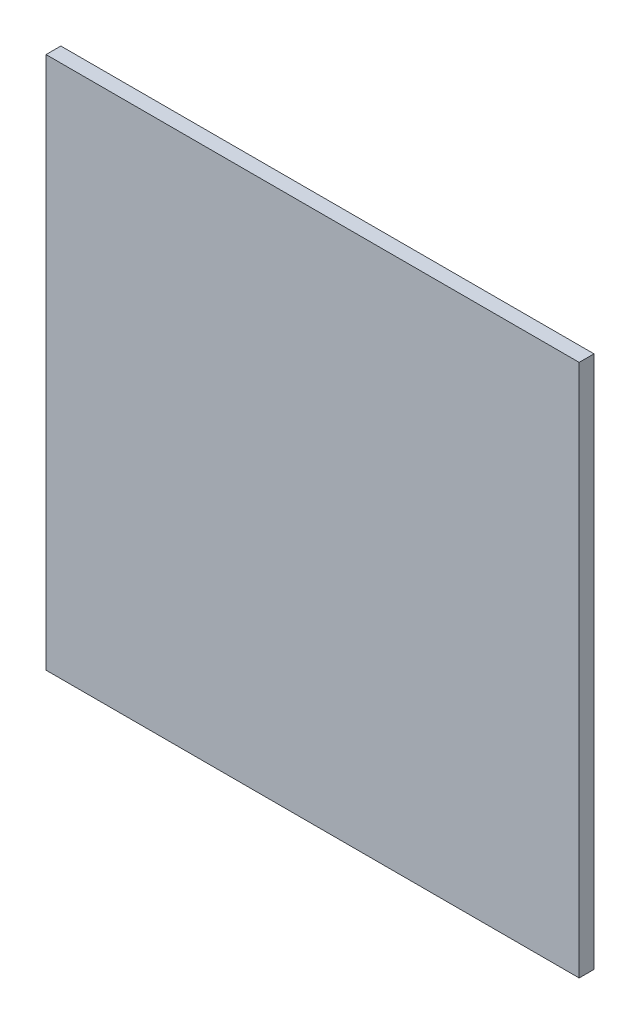
ISO-10303-21;
HEADER;
FILE_DESCRIPTION(('STEP AP214'),'2;1');
FILE_NAME('part.step','',(''),(''),'','','');
FILE_SCHEMA(('AUTOMOTIVE_DESIGN { 1 0 10303 214 1 1 1 1 }'));
ENDSEC;
DATA;
#1=APPLICATION_CONTEXT('core data for automotive mechanical design processes');
#2=APPLICATION_PROTOCOL_DEFINITION('international standard','automotive_design',2000,#1);
#3=PRODUCT_CONTEXT('',#1,'mechanical');
#4=PRODUCT('Part','Part','',(#3));
#5=PRODUCT_RELATED_PRODUCT_CATEGORY('part','',(#4));
#6=PRODUCT_DEFINITION_FORMATION('','',#4);
#7=PRODUCT_DEFINITION_CONTEXT('part definition',#1,'design');
#8=PRODUCT_DEFINITION('design','',#6,#7);
#9=PRODUCT_DEFINITION_SHAPE('','',#8);
#10=(LENGTH_UNIT() NAMED_UNIT(*) SI_UNIT(.MILLI.,.METRE.));
#11=(NAMED_UNIT(*) PLANE_ANGLE_UNIT() SI_UNIT($,.RADIAN.));
#12=(NAMED_UNIT(*) SI_UNIT($,.STERADIAN.) SOLID_ANGLE_UNIT());
#13=UNCERTAINTY_MEASURE_WITH_UNIT(LENGTH_MEASURE(1.E-05),#10,'distance_accuracy_value','');
#14=(GEOMETRIC_REPRESENTATION_CONTEXT(3) GLOBAL_UNCERTAINTY_ASSIGNED_CONTEXT((#13)) GLOBAL_UNIT_ASSIGNED_CONTEXT((#10,
#11,#12)) REPRESENTATION_CONTEXT('',''));
#15=CARTESIAN_POINT('',(0.,0.,0.));
#16=DIRECTION('',(0.,0.,1.));
#17=DIRECTION('',(1.,0.,0.));
#18=AXIS2_PLACEMENT_3D('',#15,#16,#17);
#19=CARTESIAN_POINT('',(90.,-90.,5.));
#20=DIRECTION('',(-1.,0.,0.));
#21=DIRECTION('',(0.,0.,1.));
#22=AXIS2_PLACEMENT_3D('',#19,#20,#21);
#23=PLANE('',#22);
#24=DIRECTION('',(0.,1.,0.));
#25=VECTOR('',#24,1.);
#26=CARTESIAN_POINT('',(90.,-90.,0.));
#27=LINE('',#26,#25);
#28=CARTESIAN_POINT('',(90.,-90.,0.));
#29=VERTEX_POINT('',#28);
#30=CARTESIAN_POINT('',(90.,90.,0.));
#31=VERTEX_POINT('',#30);
#32=EDGE_CURVE('E97',#29,#31,#27,.T.);
#33=ORIENTED_EDGE('',*,*,#32,.T.);
#34=DIRECTION('',(0.,0.,-1.));
#35=VECTOR('',#34,1.);
#36=CARTESIAN_POINT('',(90.,90.,5.));
#37=LINE('',#36,#35);
#38=CARTESIAN_POINT('',(90.,90.,5.));
#39=VERTEX_POINT('',#38);
#40=EDGE_CURVE('E11',#39,#31,#37,.T.);
#41=ORIENTED_EDGE('',*,*,#40,.F.);
#42=DIRECTION('',(0.,1.,0.));
#43=VECTOR('',#42,1.);
#44=CARTESIAN_POINT('',(90.,-90.,5.));
#45=LINE('',#44,#43);
#46=CARTESIAN_POINT('',(90.,-90.,5.));
#47=VERTEX_POINT('',#46);
#48=EDGE_CURVE('E85',#47,#39,#45,.T.);
#49=ORIENTED_EDGE('',*,*,#48,.F.);
#50=DIRECTION('',(0.,0.,-1.));
#51=VECTOR('',#50,1.);
#52=CARTESIAN_POINT('',(90.,-90.,5.));
#53=LINE('',#52,#51);
#54=EDGE_CURVE('E93',#47,#29,#53,.T.);
#55=ORIENTED_EDGE('',*,*,#54,.T.);
#56=EDGE_LOOP('',(#33,#41,#49,#55));
#57=FACE_BOUND('',#56,.T.);
#58=ADVANCED_FACE('F34',(#57),#23,.F.);
#59=CARTESIAN_POINT('',(-90.,90.,5.));
#60=DIRECTION('',(0.,-1.,0.));
#61=DIRECTION('',(0.,0.,-1.));
#62=AXIS2_PLACEMENT_3D('',#59,#60,#61);
#63=PLANE('',#62);
#64=DIRECTION('',(-1.,0.,0.));
#65=VECTOR('',#64,1.);
#66=CARTESIAN_POINT('',(-90.,90.,0.));
#67=LINE('',#66,#65);
#68=CARTESIAN_POINT('',(-90.,90.,0.));
#69=VERTEX_POINT('',#68);
#70=EDGE_CURVE('E89',#31,#69,#67,.T.);
#71=ORIENTED_EDGE('',*,*,#70,.T.);
#72=DIRECTION('',(0.,0.,-1.));
#73=VECTOR('',#72,1.);
#74=CARTESIAN_POINT('',(-90.,90.,5.));
#75=LINE('',#74,#73);
#76=CARTESIAN_POINT('',(-90.,90.,5.));
#77=VERTEX_POINT('',#76);
#78=EDGE_CURVE('E42',#77,#69,#75,.T.);
#79=ORIENTED_EDGE('',*,*,#78,.F.);
#80=DIRECTION('',(-1.,0.,0.));
#81=VECTOR('',#80,1.);
#82=CARTESIAN_POINT('',(-90.,90.,5.));
#83=LINE('',#82,#81);
#84=EDGE_CURVE('E80',#39,#77,#83,.T.);
#85=ORIENTED_EDGE('',*,*,#84,.F.);
#86=ORIENTED_EDGE('',*,*,#40,.T.);
#87=EDGE_LOOP('',(#71,#79,#85,#86));
#88=FACE_BOUND('',#87,.T.);
#89=ADVANCED_FACE('F88',(#88),#63,.F.);
#90=CARTESIAN_POINT('',(-90.,-90.,5.));
#91=DIRECTION('',(1.,0.,0.));
#92=DIRECTION('',(0.,0.,-1.));
#93=AXIS2_PLACEMENT_3D('',#90,#91,#92);
#94=PLANE('',#93);
#95=DIRECTION('',(0.,-1.,0.));
#96=VECTOR('',#95,1.);
#97=CARTESIAN_POINT('',(-90.,-90.,0.));
#98=LINE('',#97,#96);
#99=CARTESIAN_POINT('',(-90.,-90.,0.));
#100=VERTEX_POINT('',#99);
#101=EDGE_CURVE('E67',#69,#100,#98,.T.);
#102=ORIENTED_EDGE('',*,*,#101,.T.);
#103=DIRECTION('',(0.,0.,-1.));
#104=VECTOR('',#103,1.);
#105=CARTESIAN_POINT('',(-90.,-90.,5.));
#106=LINE('',#105,#104);
#107=CARTESIAN_POINT('',(-90.,-90.,5.));
#108=VERTEX_POINT('',#107);
#109=EDGE_CURVE('E90',#108,#100,#106,.T.);
#110=ORIENTED_EDGE('',*,*,#109,.F.);
#111=DIRECTION('',(0.,-1.,0.));
#112=VECTOR('',#111,1.);
#113=CARTESIAN_POINT('',(-90.,-90.,5.));
#114=LINE('',#113,#112);
#115=EDGE_CURVE('E83',#77,#108,#114,.T.);
#116=ORIENTED_EDGE('',*,*,#115,.F.);
#117=ORIENTED_EDGE('',*,*,#78,.T.);
#118=EDGE_LOOP('',(#102,#110,#116,#117));
#119=FACE_BOUND('',#118,.T.);
#120=ADVANCED_FACE('F91',(#119),#94,.F.);
#121=CARTESIAN_POINT('',(-90.,-90.,5.));
#122=DIRECTION('',(0.,1.,0.));
#123=DIRECTION('',(0.,0.,1.));
#124=AXIS2_PLACEMENT_3D('',#121,#122,#123);
#125=PLANE('',#124);
#126=DIRECTION('',(1.,0.,0.));
#127=VECTOR('',#126,1.);
#128=CARTESIAN_POINT('',(-90.,-90.,0.));
#129=LINE('',#128,#127);
#130=EDGE_CURVE('E73',#100,#29,#129,.T.);
#131=ORIENTED_EDGE('',*,*,#130,.T.);
#132=ORIENTED_EDGE('',*,*,#54,.F.);
#133=DIRECTION('',(1.,0.,0.));
#134=VECTOR('',#133,1.);
#135=CARTESIAN_POINT('',(-90.,-90.,5.));
#136=LINE('',#135,#134);
#137=EDGE_CURVE('E50',#108,#47,#136,.T.);
#138=ORIENTED_EDGE('',*,*,#137,.F.);
#139=ORIENTED_EDGE('',*,*,#109,.T.);
#140=EDGE_LOOP('',(#131,#132,#138,#139));
#141=FACE_BOUND('',#140,.T.);
#142=ADVANCED_FACE('F104',(#141),#125,.F.);
#143=CARTESIAN_POINT('',(0.,0.,5.));
#144=DIRECTION('',(0.,0.,-1.));
#145=DIRECTION('',(-1.,0.,0.));
#146=AXIS2_PLACEMENT_3D('',#143,#144,#145);
#147=PLANE('',#146);
#148=ORIENTED_EDGE('',*,*,#48,.T.);
#149=ORIENTED_EDGE('',*,*,#84,.T.);
#150=ORIENTED_EDGE('',*,*,#115,.T.);
#151=ORIENTED_EDGE('',*,*,#137,.T.);
#152=EDGE_LOOP('',(#148,#149,#150,#151));
#153=FACE_BOUND('',#152,.T.);
#154=ADVANCED_FACE('F81',(#153),#147,.F.);
#155=CARTESIAN_POINT('',(0.,0.,0.));
#156=DIRECTION('',(0.,0.,-1.));
#157=DIRECTION('',(-1.,0.,0.));
#158=AXIS2_PLACEMENT_3D('',#155,#156,#157);
#159=PLANE('',#158);
#160=ORIENTED_EDGE('',*,*,#32,.F.);
#161=ORIENTED_EDGE('',*,*,#130,.F.);
#162=ORIENTED_EDGE('',*,*,#101,.F.);
#163=ORIENTED_EDGE('',*,*,#70,.F.);
#164=EDGE_LOOP('',(#160,#161,#162,#163));
#165=FACE_BOUND('',#164,.T.);
#166=ADVANCED_FACE('F107',(#165),#159,.T.);
#167=CLOSED_SHELL('',(#58,#89,#120,#142,#154,#166));
#168=MANIFOLD_SOLID_BREP('B2',#167);
#169=ADVANCED_BREP_SHAPE_REPRESENTATION('',(#18,#168),#14);
#170=SHAPE_DEFINITION_REPRESENTATION(#9,#169);
ENDSEC;
END-ISO-10303-21;
